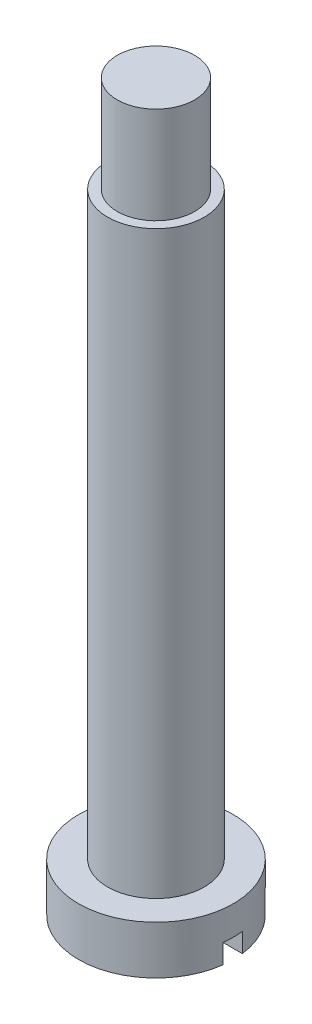
ISO-10303-21;
HEADER;
FILE_DESCRIPTION(('STEP AP214'),'2;1');
FILE_NAME('part.step','',(''),(''),'','','');
FILE_SCHEMA(('AUTOMOTIVE_DESIGN { 1 0 10303 214 1 1 1 1 }'));
ENDSEC;
DATA;
#1=APPLICATION_CONTEXT('core data for automotive mechanical design processes');
#2=APPLICATION_PROTOCOL_DEFINITION('international standard','automotive_design',2000,#1);
#3=PRODUCT_CONTEXT('',#1,'mechanical');
#4=PRODUCT('Part','Part','',(#3));
#5=PRODUCT_RELATED_PRODUCT_CATEGORY('part','',(#4));
#6=PRODUCT_DEFINITION_FORMATION('','',#4);
#7=PRODUCT_DEFINITION_CONTEXT('part definition',#1,'design');
#8=PRODUCT_DEFINITION('design','',#6,#7);
#9=PRODUCT_DEFINITION_SHAPE('','',#8);
#10=(LENGTH_UNIT() NAMED_UNIT(*) SI_UNIT(.MILLI.,.METRE.));
#11=(NAMED_UNIT(*) PLANE_ANGLE_UNIT() SI_UNIT($,.RADIAN.));
#12=(NAMED_UNIT(*) SI_UNIT($,.STERADIAN.) SOLID_ANGLE_UNIT());
#13=UNCERTAINTY_MEASURE_WITH_UNIT(LENGTH_MEASURE(1.E-05),#10,'distance_accuracy_value','');
#14=(GEOMETRIC_REPRESENTATION_CONTEXT(3) GLOBAL_UNCERTAINTY_ASSIGNED_CONTEXT((#13)) GLOBAL_UNIT_ASSIGNED_CONTEXT((#10,
#11,#12)) REPRESENTATION_CONTEXT('',''));
#15=CARTESIAN_POINT('',(0.,0.,0.));
#16=DIRECTION('',(0.,0.,1.));
#17=DIRECTION('',(1.,0.,0.));
#18=AXIS2_PLACEMENT_3D('',#15,#16,#17);
#19=CARTESIAN_POINT('',(0.,-2.5,0.));
#20=DIRECTION('',(0.,1.,0.));
#21=DIRECTION('',(0.,0.,1.));
#22=AXIS2_PLACEMENT_3D('',#19,#20,#21);
#23=CYLINDRICAL_SURFACE('',#22,4.);
#24=CARTESIAN_POINT('',(0.,0.,0.));
#25=DIRECTION('',(0.,1.,0.));
#26=DIRECTION('',(0.,0.,1.));
#27=AXIS2_PLACEMENT_3D('',#24,#25,#26);
#28=CIRCLE('',#27,4.);
#29=CARTESIAN_POINT('',(0.,0.,4.));
#30=VERTEX_POINT('',#29);
#31=EDGE_CURVE('E127',#30,#30,#28,.T.);
#32=ORIENTED_EDGE('',*,*,#31,.F.);
#33=EDGE_LOOP('',(#32));
#34=FACE_BOUND('',#33,.T.);
#35=CARTESIAN_POINT('',(0.,-2.5,0.));
#36=DIRECTION('',(0.,1.,0.));
#37=DIRECTION('',(0.,0.,1.));
#38=AXIS2_PLACEMENT_3D('',#35,#36,#37);
#39=CIRCLE('',#38,4.);
#40=CARTESIAN_POINT('',(3.96862696659689,-2.5,-0.5));
#41=VERTEX_POINT('',#40);
#42=CARTESIAN_POINT('',(-3.96862696659689,-2.5,-0.5));
#43=VERTEX_POINT('',#42);
#44=EDGE_CURVE('E131',#41,#43,#39,.T.);
#45=ORIENTED_EDGE('',*,*,#44,.T.);
#46=DIRECTION('',(0.,1.,0.));
#47=VECTOR('',#46,1.);
#48=CARTESIAN_POINT('',(-3.96862696659689,-2.5,-0.5));
#49=LINE('',#48,#47);
#50=CARTESIAN_POINT('',(-3.96862696659689,-1.5,-0.5));
#51=VERTEX_POINT('',#50);
#52=EDGE_CURVE('E90',#43,#51,#49,.T.);
#53=ORIENTED_EDGE('',*,*,#52,.T.);
#54=CARTESIAN_POINT('',(0.,-1.5,0.));
#55=DIRECTION('',(0.,1.,0.));
#56=DIRECTION('',(0.,0.,1.));
#57=AXIS2_PLACEMENT_3D('',#54,#55,#56);
#58=CIRCLE('',#57,4.);
#59=CARTESIAN_POINT('',(-3.96862696659689,-1.5,0.5));
#60=VERTEX_POINT('',#59);
#61=EDGE_CURVE('E11',#60,#51,#58,.F.);
#62=ORIENTED_EDGE('',*,*,#61,.F.);
#63=DIRECTION('',(0.,1.,0.));
#64=VECTOR('',#63,1.);
#65=CARTESIAN_POINT('',(-3.96862696659689,-2.5,0.5));
#66=LINE('',#65,#64);
#67=CARTESIAN_POINT('',(-3.96862696659689,-2.5,0.5));
#68=VERTEX_POINT('',#67);
#69=EDGE_CURVE('E88',#68,#60,#66,.T.);
#70=ORIENTED_EDGE('',*,*,#69,.F.);
#71=CARTESIAN_POINT('',(3.96862696659689,-2.5,0.5));
#72=VERTEX_POINT('',#71);
#73=EDGE_CURVE('E132',#68,#72,#39,.T.);
#74=ORIENTED_EDGE('',*,*,#73,.T.);
#75=DIRECTION('',(0.,1.,0.));
#76=VECTOR('',#75,1.);
#77=CARTESIAN_POINT('',(3.96862696659689,-2.5,0.5));
#78=LINE('',#77,#76);
#79=CARTESIAN_POINT('',(3.96862696659689,-1.5,0.5));
#80=VERTEX_POINT('',#79);
#81=EDGE_CURVE('E58',#80,#72,#78,.F.);
#82=ORIENTED_EDGE('',*,*,#81,.F.);
#83=CARTESIAN_POINT('',(3.96862696659689,-1.5,-0.5));
#84=VERTEX_POINT('',#83);
#85=EDGE_CURVE('E46',#84,#80,#58,.F.);
#86=ORIENTED_EDGE('',*,*,#85,.F.);
#87=DIRECTION('',(0.,1.,0.));
#88=VECTOR('',#87,1.);
#89=CARTESIAN_POINT('',(3.96862696659689,-2.5,-0.5));
#90=LINE('',#89,#88);
#91=EDGE_CURVE('E111',#84,#41,#90,.F.);
#92=ORIENTED_EDGE('',*,*,#91,.T.);
#93=EDGE_LOOP('',(#45,#53,#62,#70,#74,#82,#86,#92));
#94=FACE_BOUND('',#93,.T.);
#95=ADVANCED_FACE('F43',(#34,#94),#23,.T.);
#96=CARTESIAN_POINT('',(0.,-2.5,0.));
#97=DIRECTION('',(0.,1.,0.));
#98=DIRECTION('',(0.,0.,1.));
#99=AXIS2_PLACEMENT_3D('',#96,#97,#98);
#100=PLANE('',#99);
#101=DIRECTION('',(1.,0.,0.));
#102=VECTOR('',#101,1.);
#103=CARTESIAN_POINT('',(0.,-2.5,-0.5));
#104=LINE('',#103,#102);
#105=EDGE_CURVE('E66',#43,#41,#104,.T.);
#106=ORIENTED_EDGE('',*,*,#105,.F.);
#107=ORIENTED_EDGE('',*,*,#44,.F.);
#108=EDGE_LOOP('',(#106,#107));
#109=FACE_BOUND('',#108,.T.);
#110=ADVANCED_FACE('F144',(#109),#100,.F.);
#111=ORIENTED_EDGE('',*,*,#73,.F.);
#112=DIRECTION('',(1.,0.,0.));
#113=VECTOR('',#112,1.);
#114=CARTESIAN_POINT('',(0.,-2.5,0.5));
#115=LINE('',#114,#113);
#116=EDGE_CURVE('E97',#68,#72,#115,.T.);
#117=ORIENTED_EDGE('',*,*,#116,.T.);
#118=EDGE_LOOP('',(#111,#117));
#119=FACE_BOUND('',#118,.T.);
#120=ADVANCED_FACE('F146',(#119),#100,.F.);
#121=CARTESIAN_POINT('',(0.,0.,0.));
#122=DIRECTION('',(0.,1.,0.));
#123=DIRECTION('',(0.,0.,1.));
#124=AXIS2_PLACEMENT_3D('',#121,#122,#123);
#125=PLANE('',#124);
#126=CARTESIAN_POINT('',(0.,0.,0.));
#127=DIRECTION('',(0.,1.,0.));
#128=DIRECTION('',(0.,0.,1.));
#129=AXIS2_PLACEMENT_3D('',#126,#127,#128);
#130=CIRCLE('',#129,2.5);
#131=CARTESIAN_POINT('',(0.,0.,2.5));
#132=VERTEX_POINT('',#131);
#133=EDGE_CURVE('E123',#132,#132,#130,.T.);
#134=ORIENTED_EDGE('',*,*,#133,.F.);
#135=EDGE_LOOP('',(#134));
#136=FACE_BOUND('',#135,.T.);
#137=ORIENTED_EDGE('',*,*,#31,.T.);
#138=EDGE_LOOP('',(#137));
#139=FACE_BOUND('',#138,.T.);
#140=ADVANCED_FACE('F152',(#136,#139),#125,.T.);
#141=CARTESIAN_POINT('',(0.,30.,0.));
#142=DIRECTION('',(0.,-1.,0.));
#143=DIRECTION('',(0.,0.,-1.));
#144=AXIS2_PLACEMENT_3D('',#141,#142,#143);
#145=CYLINDRICAL_SURFACE('',#144,2.5);
#146=CARTESIAN_POINT('',(0.,30.,0.));
#147=DIRECTION('',(0.,1.,0.));
#148=DIRECTION('',(0.,0.,1.));
#149=AXIS2_PLACEMENT_3D('',#146,#147,#148);
#150=CIRCLE('',#149,2.5);
#151=CARTESIAN_POINT('',(0.,30.,2.5));
#152=VERTEX_POINT('',#151);
#153=EDGE_CURVE('E118',#152,#152,#150,.T.);
#154=ORIENTED_EDGE('',*,*,#153,.F.);
#155=EDGE_LOOP('',(#154));
#156=FACE_BOUND('',#155,.T.);
#157=ORIENTED_EDGE('',*,*,#133,.T.);
#158=EDGE_LOOP('',(#157));
#159=FACE_BOUND('',#158,.T.);
#160=ADVANCED_FACE('F156',(#156,#159),#145,.T.);
#161=CARTESIAN_POINT('',(0.,30.,0.));
#162=DIRECTION('',(0.,1.,0.));
#163=DIRECTION('',(0.,0.,1.));
#164=AXIS2_PLACEMENT_3D('',#161,#162,#163);
#165=PLANE('',#164);
#166=CARTESIAN_POINT('',(0.,30.,0.));
#167=DIRECTION('',(0.,1.,0.));
#168=DIRECTION('',(0.,0.,1.));
#169=AXIS2_PLACEMENT_3D('',#166,#167,#168);
#170=CIRCLE('',#169,2.);
#171=CARTESIAN_POINT('',(0.,30.,2.));
#172=VERTEX_POINT('',#171);
#173=EDGE_CURVE('E119',#172,#172,#170,.T.);
#174=ORIENTED_EDGE('',*,*,#173,.F.);
#175=EDGE_LOOP('',(#174));
#176=FACE_BOUND('',#175,.T.);
#177=ORIENTED_EDGE('',*,*,#153,.T.);
#178=EDGE_LOOP('',(#177));
#179=FACE_BOUND('',#178,.T.);
#180=ADVANCED_FACE('F163',(#176,#179),#165,.T.);
#181=CARTESIAN_POINT('',(0.,35.,0.));
#182=DIRECTION('',(0.,-1.,0.));
#183=DIRECTION('',(0.,0.,-1.));
#184=AXIS2_PLACEMENT_3D('',#181,#182,#183);
#185=CYLINDRICAL_SURFACE('',#184,2.);
#186=CARTESIAN_POINT('',(0.,35.,0.));
#187=DIRECTION('',(0.,1.,0.));
#188=DIRECTION('',(0.,0.,1.));
#189=AXIS2_PLACEMENT_3D('',#186,#187,#188);
#190=CIRCLE('',#189,2.);
#191=CARTESIAN_POINT('',(0.,35.,2.));
#192=VERTEX_POINT('',#191);
#193=EDGE_CURVE('E114',#192,#192,#190,.T.);
#194=ORIENTED_EDGE('',*,*,#193,.F.);
#195=EDGE_LOOP('',(#194));
#196=FACE_BOUND('',#195,.T.);
#197=ORIENTED_EDGE('',*,*,#173,.T.);
#198=EDGE_LOOP('',(#197));
#199=FACE_BOUND('',#198,.T.);
#200=ADVANCED_FACE('F172',(#196,#199),#185,.T.);
#201=CARTESIAN_POINT('',(0.,35.,0.));
#202=DIRECTION('',(0.,1.,0.));
#203=DIRECTION('',(0.,0.,1.));
#204=AXIS2_PLACEMENT_3D('',#201,#202,#203);
#205=PLANE('',#204);
#206=ORIENTED_EDGE('',*,*,#193,.T.);
#207=EDGE_LOOP('',(#206));
#208=FACE_BOUND('',#207,.T.);
#209=ADVANCED_FACE('F179',(#208),#205,.T.);
#210=CARTESIAN_POINT('',(-4.,-2.500012,-0.5));
#211=DIRECTION('',(0.,0.,1.));
#212=DIRECTION('',(1.,0.,0.));
#213=AXIS2_PLACEMENT_3D('',#210,#211,#212);
#214=PLANE('',#213);
#215=DIRECTION('',(1.,0.,0.));
#216=VECTOR('',#215,1.);
#217=CARTESIAN_POINT('',(-4.,-1.5,-0.5));
#218=LINE('',#217,#216);
#219=EDGE_CURVE('E102',#51,#84,#218,.T.);
#220=ORIENTED_EDGE('',*,*,#219,.F.);
#221=ORIENTED_EDGE('',*,*,#52,.F.);
#222=ORIENTED_EDGE('',*,*,#105,.T.);
#223=ORIENTED_EDGE('',*,*,#91,.F.);
#224=EDGE_LOOP('',(#220,#221,#222,#223));
#225=FACE_BOUND('',#224,.T.);
#226=ADVANCED_FACE('F186',(#225),#214,.T.);
#227=CARTESIAN_POINT('',(-4.,-2.500012,0.5));
#228=DIRECTION('',(0.,0.,1.));
#229=DIRECTION('',(1.,0.,0.));
#230=AXIS2_PLACEMENT_3D('',#227,#228,#229);
#231=PLANE('',#230);
#232=ORIENTED_EDGE('',*,*,#81,.T.);
#233=ORIENTED_EDGE('',*,*,#116,.F.);
#234=ORIENTED_EDGE('',*,*,#69,.T.);
#235=DIRECTION('',(1.,0.,0.));
#236=VECTOR('',#235,1.);
#237=CARTESIAN_POINT('',(-4.,-1.5,0.5));
#238=LINE('',#237,#236);
#239=EDGE_CURVE('E96',#60,#80,#238,.T.);
#240=ORIENTED_EDGE('',*,*,#239,.T.);
#241=EDGE_LOOP('',(#232,#233,#234,#240));
#242=FACE_BOUND('',#241,.T.);
#243=ADVANCED_FACE('F95',(#242),#231,.F.);
#244=CARTESIAN_POINT('',(0.,-1.5,0.));
#245=DIRECTION('',(0.,1.,0.));
#246=DIRECTION('',(-1.,0.,0.));
#247=AXIS2_PLACEMENT_3D('',#244,#245,#246);
#248=PLANE('',#247);
#249=ORIENTED_EDGE('',*,*,#239,.F.);
#250=ORIENTED_EDGE('',*,*,#61,.T.);
#251=ORIENTED_EDGE('',*,*,#219,.T.);
#252=ORIENTED_EDGE('',*,*,#85,.T.);
#253=EDGE_LOOP('',(#249,#250,#251,#252));
#254=FACE_BOUND('',#253,.T.);
#255=ADVANCED_FACE('F100',(#254),#248,.F.);
#256=CLOSED_SHELL('',(#95,#110,#120,#140,#160,#180,#200,#209,#226,#243,#255));
#257=MANIFOLD_SOLID_BREP('B2',#256);
#258=ADVANCED_BREP_SHAPE_REPRESENTATION('',(#18,#257),#14);
#259=SHAPE_DEFINITION_REPRESENTATION(#9,#258);
ENDSEC;
END-ISO-10303-21;
